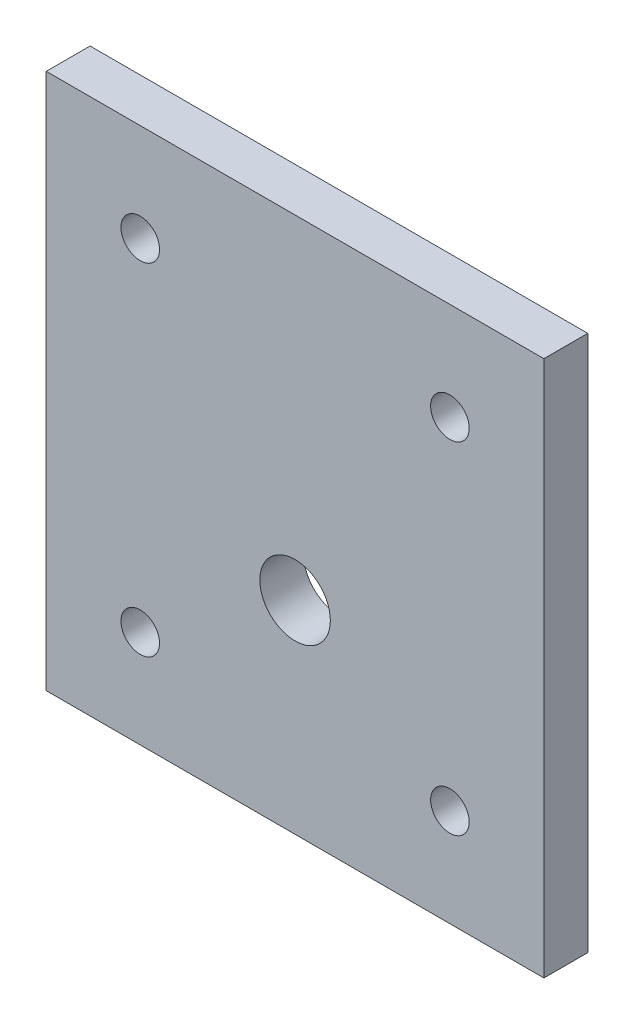
ISO-10303-21;
HEADER;
FILE_DESCRIPTION(('STEP AP214'),'2;1');
FILE_NAME('part.step','',(''),(''),'','','');
FILE_SCHEMA(('AUTOMOTIVE_DESIGN { 1 0 10303 214 1 1 1 1 }'));
ENDSEC;
DATA;
#1=APPLICATION_CONTEXT('core data for automotive mechanical design processes');
#2=APPLICATION_PROTOCOL_DEFINITION('international standard','automotive_design',2000,#1);
#3=PRODUCT_CONTEXT('',#1,'mechanical');
#4=PRODUCT('Part','Part','',(#3));
#5=PRODUCT_RELATED_PRODUCT_CATEGORY('part','',(#4));
#6=PRODUCT_DEFINITION_FORMATION('','',#4);
#7=PRODUCT_DEFINITION_CONTEXT('part definition',#1,'design');
#8=PRODUCT_DEFINITION('design','',#6,#7);
#9=PRODUCT_DEFINITION_SHAPE('','',#8);
#10=(LENGTH_UNIT() NAMED_UNIT(*) SI_UNIT(.MILLI.,.METRE.));
#11=(NAMED_UNIT(*) PLANE_ANGLE_UNIT() SI_UNIT($,.RADIAN.));
#12=(NAMED_UNIT(*) SI_UNIT($,.STERADIAN.) SOLID_ANGLE_UNIT());
#13=UNCERTAINTY_MEASURE_WITH_UNIT(LENGTH_MEASURE(1.E-05),#10,'distance_accuracy_value','');
#14=(GEOMETRIC_REPRESENTATION_CONTEXT(3) GLOBAL_UNCERTAINTY_ASSIGNED_CONTEXT((#13)) GLOBAL_UNIT_ASSIGNED_CONTEXT((#10,
#11,#12)) REPRESENTATION_CONTEXT('',''));
#15=CARTESIAN_POINT('',(0.,0.,0.));
#16=DIRECTION('',(0.,0.,1.));
#17=DIRECTION('',(1.,0.,0.));
#18=AXIS2_PLACEMENT_3D('',#15,#16,#17);
#19=CARTESIAN_POINT('',(0.,0.,3.175));
#20=DIRECTION('',(0.,0.,1.));
#21=DIRECTION('',(1.,0.,0.));
#22=AXIS2_PLACEMENT_3D('',#19,#20,#21);
#23=PLANE('',#22);
#24=CARTESIAN_POINT('',(45.9189138248361,-26.6843921091761,3.175));
#25=DIRECTION('',(0.,0.,1.));
#26=DIRECTION('',(1.,0.,0.));
#27=AXIS2_PLACEMENT_3D('',#24,#25,#26);
#28=CIRCLE('',#27,1.39700000000001);
#29=CARTESIAN_POINT('',(47.3159138248361,-26.6843921091761,3.175));
#30=VERTEX_POINT('',#29);
#31=EDGE_CURVE('E127',#30,#30,#28,.T.);
#32=ORIENTED_EDGE('',*,*,#31,.F.);
#33=EDGE_LOOP('',(#32));
#34=FACE_BOUND('',#33,.T.);
#35=CARTESIAN_POINT('',(23.5033815167566,-2.00062141277905,3.175));
#36=DIRECTION('',(0.,0.,1.));
#37=DIRECTION('',(1.,0.,0.));
#38=AXIS2_PLACEMENT_3D('',#35,#36,#37);
#39=CIRCLE('',#38,1.397);
#40=CARTESIAN_POINT('',(24.9003815167566,-2.00062141277905,3.175));
#41=VERTEX_POINT('',#40);
#42=EDGE_CURVE('E115',#41,#41,#39,.T.);
#43=ORIENTED_EDGE('',*,*,#42,.F.);
#44=EDGE_LOOP('',(#43));
#45=FACE_BOUND('',#44,.T.);
#46=DIRECTION('',(0.,-1.,0.));
#47=VECTOR('',#46,1.);
#48=CARTESIAN_POINT('',(16.6986663518038,5.07094532726984,3.175));
#49=LINE('',#48,#47);
#50=CARTESIAN_POINT('',(16.6986663518038,5.07094532726984,3.175));
#51=VERTEX_POINT('',#50);
#52=CARTESIAN_POINT('',(16.6986663518038,-33.755958849225,3.175));
#53=VERTEX_POINT('',#52);
#54=EDGE_CURVE('E85',#51,#53,#49,.T.);
#55=ORIENTED_EDGE('',*,*,#54,.T.);
#56=DIRECTION('',(1.,0.,0.));
#57=VECTOR('',#56,1.);
#58=CARTESIAN_POINT('',(16.6986663518038,-33.755958849225,3.175));
#59=LINE('',#58,#57);
#60=CARTESIAN_POINT('',(52.7236289897888,-33.755958849225,3.175));
#61=VERTEX_POINT('',#60);
#62=EDGE_CURVE('E80',#53,#61,#59,.T.);
#63=ORIENTED_EDGE('',*,*,#62,.T.);
#64=DIRECTION('',(0.,1.,0.));
#65=VECTOR('',#64,1.);
#66=CARTESIAN_POINT('',(52.7236289897888,5.07094532726984,3.175));
#67=LINE('',#66,#65);
#68=CARTESIAN_POINT('',(52.7236289897888,5.07094532726984,3.175));
#69=VERTEX_POINT('',#68);
#70=EDGE_CURVE('E83',#61,#69,#67,.T.);
#71=ORIENTED_EDGE('',*,*,#70,.T.);
#72=DIRECTION('',(-1.,0.,0.));
#73=VECTOR('',#72,1.);
#74=CARTESIAN_POINT('',(16.6986663518038,5.07094532726984,3.175));
#75=LINE('',#74,#73);
#76=EDGE_CURVE('E50',#69,#51,#75,.T.);
#77=ORIENTED_EDGE('',*,*,#76,.T.);
#78=EDGE_LOOP('',(#55,#63,#71,#77));
#79=FACE_BOUND('',#78,.T.);
#80=CARTESIAN_POINT('',(45.9189138248361,-2.00062141277905,3.175));
#81=DIRECTION('',(0.,0.,1.));
#82=DIRECTION('',(1.,0.,0.));
#83=AXIS2_PLACEMENT_3D('',#80,#81,#82);
#84=CIRCLE('',#83,1.39700000000001);
#85=CARTESIAN_POINT('',(47.3159138248361,-2.00062141277905,3.175));
#86=VERTEX_POINT('',#85);
#87=EDGE_CURVE('E100',#86,#86,#84,.T.);
#88=ORIENTED_EDGE('',*,*,#87,.F.);
#89=EDGE_LOOP('',(#88));
#90=FACE_BOUND('',#89,.T.);
#91=CARTESIAN_POINT('',(23.5033815167566,-26.6843921091761,3.175));
#92=DIRECTION('',(0.,0.,1.));
#93=DIRECTION('',(1.,0.,0.));
#94=AXIS2_PLACEMENT_3D('',#91,#92,#93);
#95=CIRCLE('',#94,1.397);
#96=CARTESIAN_POINT('',(24.9003815167566,-26.6843921091761,3.175));
#97=VERTEX_POINT('',#96);
#98=EDGE_CURVE('E121',#97,#97,#95,.T.);
#99=ORIENTED_EDGE('',*,*,#98,.F.);
#100=EDGE_LOOP('',(#99));
#101=FACE_BOUND('',#100,.T.);
#102=CARTESIAN_POINT('',(34.7111476707963,-19.0791222189349,3.175));
#103=DIRECTION('',(0.,0.,1.));
#104=DIRECTION('',(1.,0.,0.));
#105=AXIS2_PLACEMENT_3D('',#102,#103,#104);
#106=CIRCLE('',#105,2.5527);
#107=CARTESIAN_POINT('',(37.2638476707963,-19.0791222189349,3.175));
#108=VERTEX_POINT('',#107);
#109=EDGE_CURVE('E133',#108,#108,#106,.T.);
#110=ORIENTED_EDGE('',*,*,#109,.F.);
#111=EDGE_LOOP('',(#110));
#112=FACE_BOUND('',#111,.T.);
#113=ADVANCED_FACE('F33',(#34,#45,#79,#90,#101,#112),#23,.T.);
#114=CARTESIAN_POINT('',(0.,0.,0.));
#115=DIRECTION('',(0.,0.,1.));
#116=DIRECTION('',(1.,0.,0.));
#117=AXIS2_PLACEMENT_3D('',#114,#115,#116);
#118=PLANE('',#117);
#119=CARTESIAN_POINT('',(45.9189138248361,-26.6843921091761,0.));
#120=DIRECTION('',(0.,0.,1.));
#121=DIRECTION('',(1.,0.,0.));
#122=AXIS2_PLACEMENT_3D('',#119,#120,#121);
#123=CIRCLE('',#122,1.39700000000001);
#124=CARTESIAN_POINT('',(47.3159138248361,-26.6843921091761,0.));
#125=VERTEX_POINT('',#124);
#126=EDGE_CURVE('E130',#125,#125,#123,.T.);
#127=ORIENTED_EDGE('',*,*,#126,.T.);
#128=EDGE_LOOP('',(#127));
#129=FACE_BOUND('',#128,.T.);
#130=CARTESIAN_POINT('',(23.5033815167566,-2.00062141277905,0.));
#131=DIRECTION('',(0.,0.,1.));
#132=DIRECTION('',(1.,0.,0.));
#133=AXIS2_PLACEMENT_3D('',#130,#131,#132);
#134=CIRCLE('',#133,1.397);
#135=CARTESIAN_POINT('',(24.9003815167566,-2.00062141277905,0.));
#136=VERTEX_POINT('',#135);
#137=EDGE_CURVE('E118',#136,#136,#134,.T.);
#138=ORIENTED_EDGE('',*,*,#137,.T.);
#139=EDGE_LOOP('',(#138));
#140=FACE_BOUND('',#139,.T.);
#141=DIRECTION('',(0.,-1.,0.));
#142=VECTOR('',#141,1.);
#143=CARTESIAN_POINT('',(16.6986663518038,5.07094532726984,0.));
#144=LINE('',#143,#142);
#145=CARTESIAN_POINT('',(16.6986663518038,5.07094532726984,0.));
#146=VERTEX_POINT('',#145);
#147=CARTESIAN_POINT('',(16.6986663518038,-33.755958849225,0.));
#148=VERTEX_POINT('',#147);
#149=EDGE_CURVE('E97',#146,#148,#144,.T.);
#150=ORIENTED_EDGE('',*,*,#149,.F.);
#151=DIRECTION('',(-1.,0.,0.));
#152=VECTOR('',#151,1.);
#153=CARTESIAN_POINT('',(16.6986663518038,5.07094532726984,0.));
#154=LINE('',#153,#152);
#155=CARTESIAN_POINT('',(52.7236289897888,5.07094532726984,0.));
#156=VERTEX_POINT('',#155);
#157=EDGE_CURVE('E73',#156,#146,#154,.T.);
#158=ORIENTED_EDGE('',*,*,#157,.F.);
#159=DIRECTION('',(0.,1.,0.));
#160=VECTOR('',#159,1.);
#161=CARTESIAN_POINT('',(52.7236289897888,5.07094532726984,0.));
#162=LINE('',#161,#160);
#163=CARTESIAN_POINT('',(52.7236289897888,-33.755958849225,0.));
#164=VERTEX_POINT('',#163);
#165=EDGE_CURVE('E67',#164,#156,#162,.T.);
#166=ORIENTED_EDGE('',*,*,#165,.F.);
#167=DIRECTION('',(1.,0.,0.));
#168=VECTOR('',#167,1.);
#169=CARTESIAN_POINT('',(16.6986663518038,-33.755958849225,0.));
#170=LINE('',#169,#168);
#171=EDGE_CURVE('E89',#148,#164,#170,.T.);
#172=ORIENTED_EDGE('',*,*,#171,.F.);
#173=EDGE_LOOP('',(#150,#158,#166,#172));
#174=FACE_BOUND('',#173,.T.);
#175=CARTESIAN_POINT('',(45.9189138248361,-2.00062141277905,0.));
#176=DIRECTION('',(0.,0.,1.));
#177=DIRECTION('',(1.,0.,0.));
#178=AXIS2_PLACEMENT_3D('',#175,#176,#177);
#179=CIRCLE('',#178,1.39700000000001);
#180=CARTESIAN_POINT('',(47.3159138248361,-2.00062141277905,0.));
#181=VERTEX_POINT('',#180);
#182=EDGE_CURVE('E112',#181,#181,#179,.T.);
#183=ORIENTED_EDGE('',*,*,#182,.T.);
#184=EDGE_LOOP('',(#183));
#185=FACE_BOUND('',#184,.T.);
#186=CARTESIAN_POINT('',(23.5033815167566,-26.6843921091761,0.));
#187=DIRECTION('',(0.,0.,1.));
#188=DIRECTION('',(1.,0.,0.));
#189=AXIS2_PLACEMENT_3D('',#186,#187,#188);
#190=CIRCLE('',#189,1.397);
#191=CARTESIAN_POINT('',(24.9003815167566,-26.6843921091761,0.));
#192=VERTEX_POINT('',#191);
#193=EDGE_CURVE('E124',#192,#192,#190,.T.);
#194=ORIENTED_EDGE('',*,*,#193,.T.);
#195=EDGE_LOOP('',(#194));
#196=FACE_BOUND('',#195,.T.);
#197=CARTESIAN_POINT('',(34.7111476707963,-19.0791222189349,0.));
#198=DIRECTION('',(0.,0.,1.));
#199=DIRECTION('',(1.,0.,0.));
#200=AXIS2_PLACEMENT_3D('',#197,#198,#199);
#201=CIRCLE('',#200,2.5527);
#202=CARTESIAN_POINT('',(37.2638476707963,-19.0791222189349,0.));
#203=VERTEX_POINT('',#202);
#204=EDGE_CURVE('E136',#203,#203,#201,.T.);
#205=ORIENTED_EDGE('',*,*,#204,.T.);
#206=EDGE_LOOP('',(#205));
#207=FACE_BOUND('',#206,.T.);
#208=ADVANCED_FACE('F108',(#129,#140,#174,#185,#196,#207),#118,.F.);
#209=CARTESIAN_POINT('',(16.6986663518038,5.07094532726984,3.175));
#210=DIRECTION('',(1.,0.,0.));
#211=DIRECTION('',(0.,0.,-1.));
#212=AXIS2_PLACEMENT_3D('',#209,#210,#211);
#213=PLANE('',#212);
#214=ORIENTED_EDGE('',*,*,#149,.T.);
#215=DIRECTION('',(0.,0.,-1.));
#216=VECTOR('',#215,1.);
#217=CARTESIAN_POINT('',(16.6986663518038,-33.755958849225,3.175));
#218=LINE('',#217,#216);
#219=EDGE_CURVE('E11',#53,#148,#218,.T.);
#220=ORIENTED_EDGE('',*,*,#219,.F.);
#221=ORIENTED_EDGE('',*,*,#54,.F.);
#222=DIRECTION('',(0.,0.,-1.));
#223=VECTOR('',#222,1.);
#224=CARTESIAN_POINT('',(16.6986663518038,5.07094532726984,3.175));
#225=LINE('',#224,#223);
#226=EDGE_CURVE('E93',#51,#146,#225,.T.);
#227=ORIENTED_EDGE('',*,*,#226,.T.);
#228=EDGE_LOOP('',(#214,#220,#221,#227));
#229=FACE_BOUND('',#228,.T.);
#230=ADVANCED_FACE('F35',(#229),#213,.F.);
#231=CARTESIAN_POINT('',(16.6986663518038,-33.755958849225,3.175));
#232=DIRECTION('',(0.,1.,0.));
#233=DIRECTION('',(0.,0.,1.));
#234=AXIS2_PLACEMENT_3D('',#231,#232,#233);
#235=PLANE('',#234);
#236=ORIENTED_EDGE('',*,*,#171,.T.);
#237=DIRECTION('',(0.,0.,-1.));
#238=VECTOR('',#237,1.);
#239=CARTESIAN_POINT('',(52.7236289897888,-33.755958849225,3.175));
#240=LINE('',#239,#238);
#241=EDGE_CURVE('E42',#61,#164,#240,.T.);
#242=ORIENTED_EDGE('',*,*,#241,.F.);
#243=ORIENTED_EDGE('',*,*,#62,.F.);
#244=ORIENTED_EDGE('',*,*,#219,.T.);
#245=EDGE_LOOP('',(#236,#242,#243,#244));
#246=FACE_BOUND('',#245,.T.);
#247=ADVANCED_FACE('F88',(#246),#235,.F.);
#248=CARTESIAN_POINT('',(52.7236289897888,5.07094532726984,3.175));
#249=DIRECTION('',(-1.,0.,0.));
#250=DIRECTION('',(0.,0.,1.));
#251=AXIS2_PLACEMENT_3D('',#248,#249,#250);
#252=PLANE('',#251);
#253=ORIENTED_EDGE('',*,*,#165,.T.);
#254=DIRECTION('',(0.,0.,-1.));
#255=VECTOR('',#254,1.);
#256=CARTESIAN_POINT('',(52.7236289897888,5.07094532726984,3.175));
#257=LINE('',#256,#255);
#258=EDGE_CURVE('E90',#69,#156,#257,.T.);
#259=ORIENTED_EDGE('',*,*,#258,.F.);
#260=ORIENTED_EDGE('',*,*,#70,.F.);
#261=ORIENTED_EDGE('',*,*,#241,.T.);
#262=EDGE_LOOP('',(#253,#259,#260,#261));
#263=FACE_BOUND('',#262,.T.);
#264=ADVANCED_FACE('F91',(#263),#252,.F.);
#265=CARTESIAN_POINT('',(16.6986663518038,5.07094532726984,3.175));
#266=DIRECTION('',(0.,-1.,0.));
#267=DIRECTION('',(0.,0.,-1.));
#268=AXIS2_PLACEMENT_3D('',#265,#266,#267);
#269=PLANE('',#268);
#270=ORIENTED_EDGE('',*,*,#157,.T.);
#271=ORIENTED_EDGE('',*,*,#226,.F.);
#272=ORIENTED_EDGE('',*,*,#76,.F.);
#273=ORIENTED_EDGE('',*,*,#258,.T.);
#274=EDGE_LOOP('',(#270,#271,#272,#273));
#275=FACE_BOUND('',#274,.T.);
#276=ADVANCED_FACE('F105',(#275),#269,.F.);
#277=CARTESIAN_POINT('',(45.9189138248361,-2.00062141277905,3.175));
#278=DIRECTION('',(0.,0.,-1.));
#279=DIRECTION('',(-1.,0.,0.));
#280=AXIS2_PLACEMENT_3D('',#277,#278,#279);
#281=CYLINDRICAL_SURFACE('',#280,1.39700000000001);
#282=ORIENTED_EDGE('',*,*,#87,.T.);
#283=EDGE_LOOP('',(#282));
#284=FACE_BOUND('',#283,.T.);
#285=ORIENTED_EDGE('',*,*,#182,.F.);
#286=EDGE_LOOP('',(#285));
#287=FACE_BOUND('',#286,.T.);
#288=ADVANCED_FACE('F156',(#284,#287),#281,.F.);
#289=CARTESIAN_POINT('',(23.5033815167566,-2.00062141277905,3.175));
#290=DIRECTION('',(0.,0.,-1.));
#291=DIRECTION('',(-1.,0.,0.));
#292=AXIS2_PLACEMENT_3D('',#289,#290,#291);
#293=CYLINDRICAL_SURFACE('',#292,1.397);
#294=ORIENTED_EDGE('',*,*,#42,.T.);
#295=EDGE_LOOP('',(#294));
#296=FACE_BOUND('',#295,.T.);
#297=ORIENTED_EDGE('',*,*,#137,.F.);
#298=EDGE_LOOP('',(#297));
#299=FACE_BOUND('',#298,.T.);
#300=ADVANCED_FACE('F202',(#296,#299),#293,.F.);
#301=CARTESIAN_POINT('',(23.5033815167566,-26.6843921091761,3.175));
#302=DIRECTION('',(0.,0.,-1.));
#303=DIRECTION('',(-1.,0.,0.));
#304=AXIS2_PLACEMENT_3D('',#301,#302,#303);
#305=CYLINDRICAL_SURFACE('',#304,1.397);
#306=ORIENTED_EDGE('',*,*,#98,.T.);
#307=EDGE_LOOP('',(#306));
#308=FACE_BOUND('',#307,.T.);
#309=ORIENTED_EDGE('',*,*,#193,.F.);
#310=EDGE_LOOP('',(#309));
#311=FACE_BOUND('',#310,.T.);
#312=ADVANCED_FACE('F210',(#308,#311),#305,.F.);
#313=CARTESIAN_POINT('',(45.9189138248361,-26.6843921091761,3.175));
#314=DIRECTION('',(0.,0.,-1.));
#315=DIRECTION('',(-1.,0.,0.));
#316=AXIS2_PLACEMENT_3D('',#313,#314,#315);
#317=CYLINDRICAL_SURFACE('',#316,1.39700000000001);
#318=ORIENTED_EDGE('',*,*,#31,.T.);
#319=EDGE_LOOP('',(#318));
#320=FACE_BOUND('',#319,.T.);
#321=ORIENTED_EDGE('',*,*,#126,.F.);
#322=EDGE_LOOP('',(#321));
#323=FACE_BOUND('',#322,.T.);
#324=ADVANCED_FACE('F218',(#320,#323),#317,.F.);
#325=CARTESIAN_POINT('',(34.7111476707963,-19.0791222189349,3.175));
#326=DIRECTION('',(0.,0.,-1.));
#327=DIRECTION('',(-1.,0.,0.));
#328=AXIS2_PLACEMENT_3D('',#325,#326,#327);
#329=CYLINDRICAL_SURFACE('',#328,2.5527);
#330=ORIENTED_EDGE('',*,*,#109,.T.);
#331=EDGE_LOOP('',(#330));
#332=FACE_BOUND('',#331,.T.);
#333=ORIENTED_EDGE('',*,*,#204,.F.);
#334=EDGE_LOOP('',(#333));
#335=FACE_BOUND('',#334,.T.);
#336=ADVANCED_FACE('F142',(#332,#335),#329,.F.);
#337=CLOSED_SHELL('',(#113,#208,#230,#247,#264,#276,#288,#300,#312,#324,#336));
#338=MANIFOLD_SOLID_BREP('B2',#337);
#339=ADVANCED_BREP_SHAPE_REPRESENTATION('',(#18,#338),#14);
#340=SHAPE_DEFINITION_REPRESENTATION(#9,#339);
ENDSEC;
END-ISO-10303-21;
